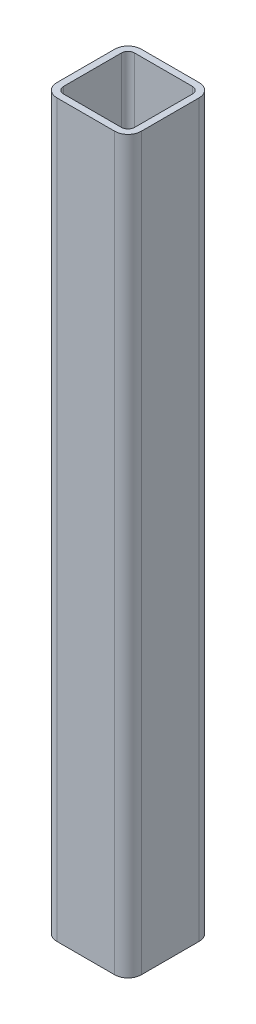
ISO-10303-21;
HEADER;
FILE_DESCRIPTION(('STEP AP214'),'2;1');
FILE_NAME('part.step','',(''),(''),'','','');
FILE_SCHEMA(('AUTOMOTIVE_DESIGN { 1 0 10303 214 1 1 1 1 }'));
ENDSEC;
DATA;
#1=APPLICATION_CONTEXT('core data for automotive mechanical design processes');
#2=APPLICATION_PROTOCOL_DEFINITION('international standard','automotive_design',2000,#1);
#3=PRODUCT_CONTEXT('',#1,'mechanical');
#4=PRODUCT('Part','Part','',(#3));
#5=PRODUCT_RELATED_PRODUCT_CATEGORY('part','',(#4));
#6=PRODUCT_DEFINITION_FORMATION('','',#4);
#7=PRODUCT_DEFINITION_CONTEXT('part definition',#1,'design');
#8=PRODUCT_DEFINITION('design','',#6,#7);
#9=PRODUCT_DEFINITION_SHAPE('','',#8);
#10=(LENGTH_UNIT() NAMED_UNIT(*) SI_UNIT(.MILLI.,.METRE.));
#11=(NAMED_UNIT(*) PLANE_ANGLE_UNIT() SI_UNIT($,.RADIAN.));
#12=(NAMED_UNIT(*) SI_UNIT($,.STERADIAN.) SOLID_ANGLE_UNIT());
#13=UNCERTAINTY_MEASURE_WITH_UNIT(LENGTH_MEASURE(1.E-05),#10,'distance_accuracy_value','');
#14=(GEOMETRIC_REPRESENTATION_CONTEXT(3) GLOBAL_UNCERTAINTY_ASSIGNED_CONTEXT((#13)) GLOBAL_UNIT_ASSIGNED_CONTEXT((#10,
#11,#12)) REPRESENTATION_CONTEXT('',''));
#15=CARTESIAN_POINT('',(0.,0.,0.));
#16=DIRECTION('',(0.,0.,1.));
#17=DIRECTION('',(1.,0.,0.));
#18=AXIS2_PLACEMENT_3D('',#15,#16,#17);
#19=CARTESIAN_POINT('',(8.7,220.,-8.7));
#20=DIRECTION('',(0.,-1.,0.));
#21=DIRECTION('',(0.,0.,-1.));
#22=AXIS2_PLACEMENT_3D('',#19,#20,#21);
#23=CYLINDRICAL_SURFACE('',#22,4.);
#24=CARTESIAN_POINT('',(8.7,0.,-8.7));
#25=DIRECTION('',(0.,1.,0.));
#26=DIRECTION('',(0.,0.,1.));
#27=AXIS2_PLACEMENT_3D('',#24,#25,#26);
#28=CIRCLE('',#27,4.);
#29=CARTESIAN_POINT('',(12.7,0.,-8.69999999999999));
#30=VERTEX_POINT('',#29);
#31=CARTESIAN_POINT('',(8.7,0.,-12.7));
#32=VERTEX_POINT('',#31);
#33=EDGE_CURVE('E239',#30,#32,#28,.T.);
#34=ORIENTED_EDGE('',*,*,#33,.T.);
#35=DIRECTION('',(0.,-1.,0.));
#36=VECTOR('',#35,1.);
#37=CARTESIAN_POINT('',(8.7,220.,-12.7));
#38=LINE('',#37,#36);
#39=CARTESIAN_POINT('',(8.7,220.,-12.7));
#40=VERTEX_POINT('',#39);
#41=EDGE_CURVE('E12',#40,#32,#38,.T.);
#42=ORIENTED_EDGE('',*,*,#41,.F.);
#43=CARTESIAN_POINT('',(8.7,220.,-8.7));
#44=DIRECTION('',(0.,1.,0.));
#45=DIRECTION('',(0.,0.,1.));
#46=AXIS2_PLACEMENT_3D('',#43,#44,#45);
#47=CIRCLE('',#46,4.);
#48=CARTESIAN_POINT('',(12.7,220.,-8.69999999999999));
#49=VERTEX_POINT('',#48);
#50=EDGE_CURVE('E317',#49,#40,#47,.T.);
#51=ORIENTED_EDGE('',*,*,#50,.F.);
#52=DIRECTION('',(0.,-1.,0.));
#53=VECTOR('',#52,1.);
#54=CARTESIAN_POINT('',(12.7,220.,-8.69999999999999));
#55=LINE('',#54,#53);
#56=EDGE_CURVE('E254',#49,#30,#55,.T.);
#57=ORIENTED_EDGE('',*,*,#56,.T.);
#58=EDGE_LOOP('',(#34,#42,#51,#57));
#59=FACE_BOUND('',#58,.T.);
#60=ADVANCED_FACE('F67',(#59),#23,.T.);
#61=CARTESIAN_POINT('',(8.7,220.,-12.7));
#62=DIRECTION('',(0.,0.,1.));
#63=DIRECTION('',(1.,0.,0.));
#64=AXIS2_PLACEMENT_3D('',#61,#62,#63);
#65=PLANE('',#64);
#66=DIRECTION('',(-1.,0.,0.));
#67=VECTOR('',#66,1.);
#68=CARTESIAN_POINT('',(8.7,0.,-12.7));
#69=LINE('',#68,#67);
#70=CARTESIAN_POINT('',(-8.7,0.,-12.7));
#71=VERTEX_POINT('',#70);
#72=EDGE_CURVE('E242',#32,#71,#69,.T.);
#73=ORIENTED_EDGE('',*,*,#72,.T.);
#74=DIRECTION('',(0.,-1.,0.));
#75=VECTOR('',#74,1.);
#76=CARTESIAN_POINT('',(-8.7,220.,-12.7));
#77=LINE('',#76,#75);
#78=CARTESIAN_POINT('',(-8.7,220.,-12.7));
#79=VERTEX_POINT('',#78);
#80=EDGE_CURVE('E77',#79,#71,#77,.T.);
#81=ORIENTED_EDGE('',*,*,#80,.F.);
#82=DIRECTION('',(-1.,0.,0.));
#83=VECTOR('',#82,1.);
#84=CARTESIAN_POINT('',(8.7,220.,-12.7));
#85=LINE('',#84,#83);
#86=EDGE_CURVE('E319',#40,#79,#85,.T.);
#87=ORIENTED_EDGE('',*,*,#86,.F.);
#88=ORIENTED_EDGE('',*,*,#41,.T.);
#89=EDGE_LOOP('',(#73,#81,#87,#88));
#90=FACE_BOUND('',#89,.T.);
#91=ADVANCED_FACE('F354',(#90),#65,.F.);
#92=CARTESIAN_POINT('',(-8.7,220.,-8.7));
#93=DIRECTION('',(0.,-1.,0.));
#94=DIRECTION('',(0.,0.,-1.));
#95=AXIS2_PLACEMENT_3D('',#92,#93,#94);
#96=CYLINDRICAL_SURFACE('',#95,4.);
#97=CARTESIAN_POINT('',(-8.7,0.,-8.7));
#98=DIRECTION('',(0.,1.,0.));
#99=DIRECTION('',(0.,0.,1.));
#100=AXIS2_PLACEMENT_3D('',#97,#98,#99);
#101=CIRCLE('',#100,4.);
#102=CARTESIAN_POINT('',(-12.7,0.,-8.69999999999999));
#103=VERTEX_POINT('',#102);
#104=EDGE_CURVE('E244',#71,#103,#101,.T.);
#105=ORIENTED_EDGE('',*,*,#104,.T.);
#106=DIRECTION('',(0.,-1.,0.));
#107=VECTOR('',#106,1.);
#108=CARTESIAN_POINT('',(-12.7,220.,-8.69999999999999));
#109=LINE('',#108,#107);
#110=CARTESIAN_POINT('',(-12.7,220.,-8.69999999999999));
#111=VERTEX_POINT('',#110);
#112=EDGE_CURVE('E261',#111,#103,#109,.T.);
#113=ORIENTED_EDGE('',*,*,#112,.F.);
#114=CARTESIAN_POINT('',(-8.7,220.,-8.7));
#115=DIRECTION('',(0.,1.,0.));
#116=DIRECTION('',(0.,0.,1.));
#117=AXIS2_PLACEMENT_3D('',#114,#115,#116);
#118=CIRCLE('',#117,4.);
#119=EDGE_CURVE('E321',#79,#111,#118,.T.);
#120=ORIENTED_EDGE('',*,*,#119,.F.);
#121=ORIENTED_EDGE('',*,*,#80,.T.);
#122=EDGE_LOOP('',(#105,#113,#120,#121));
#123=FACE_BOUND('',#122,.T.);
#124=ADVANCED_FACE('F359',(#123),#96,.T.);
#125=CARTESIAN_POINT('',(-12.7,220.,8.69999999999999));
#126=DIRECTION('',(1.,0.,0.));
#127=DIRECTION('',(0.,0.,-1.));
#128=AXIS2_PLACEMENT_3D('',#125,#126,#127);
#129=PLANE('',#128);
#130=DIRECTION('',(0.,0.,1.));
#131=VECTOR('',#130,1.);
#132=CARTESIAN_POINT('',(-12.7,0.,8.69999999999999));
#133=LINE('',#132,#131);
#134=CARTESIAN_POINT('',(-12.7,0.,8.69999999999999));
#135=VERTEX_POINT('',#134);
#136=EDGE_CURVE('E246',#103,#135,#133,.T.);
#137=ORIENTED_EDGE('',*,*,#136,.T.);
#138=DIRECTION('',(0.,-1.,0.));
#139=VECTOR('',#138,1.);
#140=CARTESIAN_POINT('',(-12.7,220.,8.69999999999999));
#141=LINE('',#140,#139);
#142=CARTESIAN_POINT('',(-12.7,220.,8.69999999999999));
#143=VERTEX_POINT('',#142);
#144=EDGE_CURVE('E258',#143,#135,#141,.T.);
#145=ORIENTED_EDGE('',*,*,#144,.F.);
#146=DIRECTION('',(0.,0.,1.));
#147=VECTOR('',#146,1.);
#148=CARTESIAN_POINT('',(-12.7,220.,8.69999999999999));
#149=LINE('',#148,#147);
#150=EDGE_CURVE('E323',#111,#143,#149,.T.);
#151=ORIENTED_EDGE('',*,*,#150,.F.);
#152=ORIENTED_EDGE('',*,*,#112,.T.);
#153=EDGE_LOOP('',(#137,#145,#151,#152));
#154=FACE_BOUND('',#153,.T.);
#155=ADVANCED_FACE('F329',(#154),#129,.F.);
#156=CARTESIAN_POINT('',(-8.7,220.,8.7));
#157=DIRECTION('',(0.,-1.,0.));
#158=DIRECTION('',(0.,0.,-1.));
#159=AXIS2_PLACEMENT_3D('',#156,#157,#158);
#160=CYLINDRICAL_SURFACE('',#159,4.);
#161=CARTESIAN_POINT('',(-8.7,0.,8.7));
#162=DIRECTION('',(0.,1.,0.));
#163=DIRECTION('',(0.,0.,1.));
#164=AXIS2_PLACEMENT_3D('',#161,#162,#163);
#165=CIRCLE('',#164,4.);
#166=CARTESIAN_POINT('',(-8.7,0.,12.7));
#167=VERTEX_POINT('',#166);
#168=EDGE_CURVE('E248',#135,#167,#165,.T.);
#169=ORIENTED_EDGE('',*,*,#168,.T.);
#170=DIRECTION('',(0.,-1.,0.));
#171=VECTOR('',#170,1.);
#172=CARTESIAN_POINT('',(-8.7,220.,12.7));
#173=LINE('',#172,#171);
#174=CARTESIAN_POINT('',(-8.7,220.,12.7));
#175=VERTEX_POINT('',#174);
#176=EDGE_CURVE('E206',#175,#167,#173,.T.);
#177=ORIENTED_EDGE('',*,*,#176,.F.);
#178=CARTESIAN_POINT('',(-8.7,220.,8.7));
#179=DIRECTION('',(0.,1.,0.));
#180=DIRECTION('',(0.,0.,1.));
#181=AXIS2_PLACEMENT_3D('',#178,#179,#180);
#182=CIRCLE('',#181,4.);
#183=EDGE_CURVE('E197',#143,#175,#182,.T.);
#184=ORIENTED_EDGE('',*,*,#183,.F.);
#185=ORIENTED_EDGE('',*,*,#144,.T.);
#186=EDGE_LOOP('',(#169,#177,#184,#185));
#187=FACE_BOUND('',#186,.T.);
#188=ADVANCED_FACE('F333',(#187),#160,.T.);
#189=CARTESIAN_POINT('',(-8.7,220.,12.7));
#190=DIRECTION('',(0.,0.,-1.));
#191=DIRECTION('',(-1.,0.,0.));
#192=AXIS2_PLACEMENT_3D('',#189,#190,#191);
#193=PLANE('',#192);
#194=DIRECTION('',(1.,0.,0.));
#195=VECTOR('',#194,1.);
#196=CARTESIAN_POINT('',(-8.7,0.,12.7));
#197=LINE('',#196,#195);
#198=CARTESIAN_POINT('',(8.7,0.,12.7));
#199=VERTEX_POINT('',#198);
#200=EDGE_CURVE('E205',#167,#199,#197,.T.);
#201=ORIENTED_EDGE('',*,*,#200,.T.);
#202=DIRECTION('',(0.,-1.,0.));
#203=VECTOR('',#202,1.);
#204=CARTESIAN_POINT('',(8.7,220.,12.7));
#205=LINE('',#204,#203);
#206=CARTESIAN_POINT('',(8.7,220.,12.7));
#207=VERTEX_POINT('',#206);
#208=EDGE_CURVE('E202',#207,#199,#205,.T.);
#209=ORIENTED_EDGE('',*,*,#208,.F.);
#210=DIRECTION('',(1.,0.,0.));
#211=VECTOR('',#210,1.);
#212=CARTESIAN_POINT('',(-8.7,220.,12.7));
#213=LINE('',#212,#211);
#214=EDGE_CURVE('E191',#175,#207,#213,.T.);
#215=ORIENTED_EDGE('',*,*,#214,.F.);
#216=ORIENTED_EDGE('',*,*,#176,.T.);
#217=EDGE_LOOP('',(#201,#209,#215,#216));
#218=FACE_BOUND('',#217,.T.);
#219=ADVANCED_FACE('F203',(#218),#193,.F.);
#220=CARTESIAN_POINT('',(8.7,220.,8.7));
#221=DIRECTION('',(0.,-1.,0.));
#222=DIRECTION('',(0.,0.,-1.));
#223=AXIS2_PLACEMENT_3D('',#220,#221,#222);
#224=CYLINDRICAL_SURFACE('',#223,4.);
#225=CARTESIAN_POINT('',(8.7,0.,8.7));
#226=DIRECTION('',(0.,1.,0.));
#227=DIRECTION('',(0.,0.,1.));
#228=AXIS2_PLACEMENT_3D('',#225,#226,#227);
#229=CIRCLE('',#228,4.);
#230=CARTESIAN_POINT('',(12.7,0.,8.69999999999999));
#231=VERTEX_POINT('',#230);
#232=EDGE_CURVE('E139',#199,#231,#229,.T.);
#233=ORIENTED_EDGE('',*,*,#232,.T.);
#234=DIRECTION('',(0.,-1.,0.));
#235=VECTOR('',#234,1.);
#236=CARTESIAN_POINT('',(12.7,220.,8.69999999999999));
#237=LINE('',#236,#235);
#238=CARTESIAN_POINT('',(12.7,220.,8.69999999999999));
#239=VERTEX_POINT('',#238);
#240=EDGE_CURVE('E207',#239,#231,#237,.T.);
#241=ORIENTED_EDGE('',*,*,#240,.F.);
#242=CARTESIAN_POINT('',(8.7,220.,8.7));
#243=DIRECTION('',(0.,1.,0.));
#244=DIRECTION('',(0.,0.,1.));
#245=AXIS2_PLACEMENT_3D('',#242,#243,#244);
#246=CIRCLE('',#245,4.);
#247=EDGE_CURVE('E195',#207,#239,#246,.T.);
#248=ORIENTED_EDGE('',*,*,#247,.F.);
#249=ORIENTED_EDGE('',*,*,#208,.T.);
#250=EDGE_LOOP('',(#233,#241,#248,#249));
#251=FACE_BOUND('',#250,.T.);
#252=ADVANCED_FACE('F209',(#251),#224,.T.);
#253=CARTESIAN_POINT('',(-8.7,220.,-8.7));
#254=DIRECTION('',(0.,-1.,0.));
#255=DIRECTION('',(0.,0.,-1.));
#256=AXIS2_PLACEMENT_3D('',#253,#254,#255);
#257=CYLINDRICAL_SURFACE('',#256,2.);
#258=CARTESIAN_POINT('',(-8.7,0.,-8.7));
#259=DIRECTION('',(0.,1.,0.));
#260=DIRECTION('',(0.,0.,1.));
#261=AXIS2_PLACEMENT_3D('',#258,#259,#260);
#262=CIRCLE('',#261,2.);
#263=CARTESIAN_POINT('',(-8.7,0.,-10.7));
#264=VERTEX_POINT('',#263);
#265=CARTESIAN_POINT('',(-10.7,0.,-8.7));
#266=VERTEX_POINT('',#265);
#267=EDGE_CURVE('E215',#264,#266,#262,.T.);
#268=ORIENTED_EDGE('',*,*,#267,.F.);
#269=DIRECTION('',(0.,-1.,0.));
#270=VECTOR('',#269,1.);
#271=CARTESIAN_POINT('',(-8.7,220.,-10.7));
#272=LINE('',#271,#270);
#273=CARTESIAN_POINT('',(-8.7,220.,-10.7));
#274=VERTEX_POINT('',#273);
#275=EDGE_CURVE('E71',#274,#264,#272,.T.);
#276=ORIENTED_EDGE('',*,*,#275,.F.);
#277=CARTESIAN_POINT('',(-8.7,220.,-8.7));
#278=DIRECTION('',(0.,1.,0.));
#279=DIRECTION('',(0.,0.,1.));
#280=AXIS2_PLACEMENT_3D('',#277,#278,#279);
#281=CIRCLE('',#280,2.);
#282=CARTESIAN_POINT('',(-10.7,220.,-8.7));
#283=VERTEX_POINT('',#282);
#284=EDGE_CURVE('E253',#274,#283,#281,.T.);
#285=ORIENTED_EDGE('',*,*,#284,.T.);
#286=DIRECTION('',(0.,-1.,0.));
#287=VECTOR('',#286,1.);
#288=CARTESIAN_POINT('',(-10.7,220.,-8.7));
#289=LINE('',#288,#287);
#290=EDGE_CURVE('E211',#283,#266,#289,.T.);
#291=ORIENTED_EDGE('',*,*,#290,.T.);
#292=EDGE_LOOP('',(#268,#276,#285,#291));
#293=FACE_BOUND('',#292,.T.);
#294=ADVANCED_FACE('F69',(#293),#257,.F.);
#295=CARTESIAN_POINT('',(8.7,220.,-10.7));
#296=DIRECTION('',(0.,0.,1.));
#297=DIRECTION('',(1.,0.,0.));
#298=AXIS2_PLACEMENT_3D('',#295,#296,#297);
#299=PLANE('',#298);
#300=DIRECTION('',(-1.,0.,0.));
#301=VECTOR('',#300,1.);
#302=CARTESIAN_POINT('',(8.7,0.,-10.7));
#303=LINE('',#302,#301);
#304=CARTESIAN_POINT('',(8.7,0.,-10.7));
#305=VERTEX_POINT('',#304);
#306=EDGE_CURVE('E218',#305,#264,#303,.T.);
#307=ORIENTED_EDGE('',*,*,#306,.F.);
#308=DIRECTION('',(0.,-1.,0.));
#309=VECTOR('',#308,1.);
#310=CARTESIAN_POINT('',(8.7,220.,-10.7));
#311=LINE('',#310,#309);
#312=CARTESIAN_POINT('',(8.7,220.,-10.7));
#313=VERTEX_POINT('',#312);
#314=EDGE_CURVE('E276',#313,#305,#311,.T.);
#315=ORIENTED_EDGE('',*,*,#314,.F.);
#316=DIRECTION('',(-1.,0.,0.));
#317=VECTOR('',#316,1.);
#318=CARTESIAN_POINT('',(8.7,220.,-10.7));
#319=LINE('',#318,#317);
#320=EDGE_CURVE('E285',#313,#274,#319,.T.);
#321=ORIENTED_EDGE('',*,*,#320,.T.);
#322=ORIENTED_EDGE('',*,*,#275,.T.);
#323=EDGE_LOOP('',(#307,#315,#321,#322));
#324=FACE_BOUND('',#323,.T.);
#325=ADVANCED_FACE('F283',(#324),#299,.T.);
#326=CARTESIAN_POINT('',(8.7,220.,-8.7));
#327=DIRECTION('',(0.,-1.,0.));
#328=DIRECTION('',(0.,0.,-1.));
#329=AXIS2_PLACEMENT_3D('',#326,#327,#328);
#330=CYLINDRICAL_SURFACE('',#329,2.);
#331=CARTESIAN_POINT('',(8.7,0.,-8.7));
#332=DIRECTION('',(0.,1.,0.));
#333=DIRECTION('',(0.,0.,1.));
#334=AXIS2_PLACEMENT_3D('',#331,#332,#333);
#335=CIRCLE('',#334,2.);
#336=CARTESIAN_POINT('',(10.7,0.,-8.7));
#337=VERTEX_POINT('',#336);
#338=EDGE_CURVE('E221',#337,#305,#335,.T.);
#339=ORIENTED_EDGE('',*,*,#338,.F.);
#340=DIRECTION('',(0.,-1.,0.));
#341=VECTOR('',#340,1.);
#342=CARTESIAN_POINT('',(10.7,220.,-8.7));
#343=LINE('',#342,#341);
#344=CARTESIAN_POINT('',(10.7,220.,-8.7));
#345=VERTEX_POINT('',#344);
#346=EDGE_CURVE('E275',#345,#337,#343,.T.);
#347=ORIENTED_EDGE('',*,*,#346,.F.);
#348=CARTESIAN_POINT('',(8.7,220.,-8.7));
#349=DIRECTION('',(0.,1.,0.));
#350=DIRECTION('',(0.,0.,1.));
#351=AXIS2_PLACEMENT_3D('',#348,#349,#350);
#352=CIRCLE('',#351,2.);
#353=EDGE_CURVE('E293',#345,#313,#352,.T.);
#354=ORIENTED_EDGE('',*,*,#353,.T.);
#355=ORIENTED_EDGE('',*,*,#314,.T.);
#356=EDGE_LOOP('',(#339,#347,#354,#355));
#357=FACE_BOUND('',#356,.T.);
#358=ADVANCED_FACE('F291',(#357),#330,.F.);
#359=CARTESIAN_POINT('',(10.7,220.,-8.7));
#360=DIRECTION('',(-1.,0.,0.));
#361=DIRECTION('',(0.,0.,1.));
#362=AXIS2_PLACEMENT_3D('',#359,#360,#361);
#363=PLANE('',#362);
#364=DIRECTION('',(0.,0.,-1.));
#365=VECTOR('',#364,1.);
#366=CARTESIAN_POINT('',(10.7,0.,-8.7));
#367=LINE('',#366,#365);
#368=CARTESIAN_POINT('',(10.7,0.,8.7));
#369=VERTEX_POINT('',#368);
#370=EDGE_CURVE('E224',#369,#337,#367,.T.);
#371=ORIENTED_EDGE('',*,*,#370,.F.);
#372=DIRECTION('',(0.,-1.,0.));
#373=VECTOR('',#372,1.);
#374=CARTESIAN_POINT('',(10.7,220.,8.7));
#375=LINE('',#374,#373);
#376=CARTESIAN_POINT('',(10.7,220.,8.7));
#377=VERTEX_POINT('',#376);
#378=EDGE_CURVE('E273',#377,#369,#375,.T.);
#379=ORIENTED_EDGE('',*,*,#378,.F.);
#380=DIRECTION('',(0.,0.,-1.));
#381=VECTOR('',#380,1.);
#382=CARTESIAN_POINT('',(10.7,220.,-8.7));
#383=LINE('',#382,#381);
#384=EDGE_CURVE('E299',#377,#345,#383,.T.);
#385=ORIENTED_EDGE('',*,*,#384,.T.);
#386=ORIENTED_EDGE('',*,*,#346,.T.);
#387=EDGE_LOOP('',(#371,#379,#385,#386));
#388=FACE_BOUND('',#387,.T.);
#389=ADVANCED_FACE('F302',(#388),#363,.T.);
#390=CARTESIAN_POINT('',(8.7,220.,8.7));
#391=DIRECTION('',(0.,-1.,0.));
#392=DIRECTION('',(0.,0.,-1.));
#393=AXIS2_PLACEMENT_3D('',#390,#391,#392);
#394=CYLINDRICAL_SURFACE('',#393,2.);
#395=CARTESIAN_POINT('',(8.7,0.,8.7));
#396=DIRECTION('',(0.,1.,0.));
#397=DIRECTION('',(0.,0.,1.));
#398=AXIS2_PLACEMENT_3D('',#395,#396,#397);
#399=CIRCLE('',#398,2.);
#400=CARTESIAN_POINT('',(8.7,0.,10.7));
#401=VERTEX_POINT('',#400);
#402=EDGE_CURVE('E227',#401,#369,#399,.T.);
#403=ORIENTED_EDGE('',*,*,#402,.F.);
#404=DIRECTION('',(0.,-1.,0.));
#405=VECTOR('',#404,1.);
#406=CARTESIAN_POINT('',(8.7,220.,10.7));
#407=LINE('',#406,#405);
#408=CARTESIAN_POINT('',(8.7,220.,10.7));
#409=VERTEX_POINT('',#408);
#410=EDGE_CURVE('E271',#409,#401,#407,.T.);
#411=ORIENTED_EDGE('',*,*,#410,.F.);
#412=CARTESIAN_POINT('',(8.7,220.,8.7));
#413=DIRECTION('',(0.,1.,0.));
#414=DIRECTION('',(0.,0.,1.));
#415=AXIS2_PLACEMENT_3D('',#412,#413,#414);
#416=CIRCLE('',#415,2.);
#417=EDGE_CURVE('E303',#409,#377,#416,.T.);
#418=ORIENTED_EDGE('',*,*,#417,.T.);
#419=ORIENTED_EDGE('',*,*,#378,.T.);
#420=EDGE_LOOP('',(#403,#411,#418,#419));
#421=FACE_BOUND('',#420,.T.);
#422=ADVANCED_FACE('F370',(#421),#394,.F.);
#423=CARTESIAN_POINT('',(-8.7,220.,10.7));
#424=DIRECTION('',(0.,0.,-1.));
#425=DIRECTION('',(-1.,0.,0.));
#426=AXIS2_PLACEMENT_3D('',#423,#424,#425);
#427=PLANE('',#426);
#428=DIRECTION('',(1.,0.,0.));
#429=VECTOR('',#428,1.);
#430=CARTESIAN_POINT('',(-8.7,0.,10.7));
#431=LINE('',#430,#429);
#432=CARTESIAN_POINT('',(-8.7,0.,10.7));
#433=VERTEX_POINT('',#432);
#434=EDGE_CURVE('E230',#433,#401,#431,.T.);
#435=ORIENTED_EDGE('',*,*,#434,.F.);
#436=DIRECTION('',(0.,-1.,0.));
#437=VECTOR('',#436,1.);
#438=CARTESIAN_POINT('',(-8.7,220.,10.7));
#439=LINE('',#438,#437);
#440=CARTESIAN_POINT('',(-8.7,220.,10.7));
#441=VERTEX_POINT('',#440);
#442=EDGE_CURVE('E269',#441,#433,#439,.T.);
#443=ORIENTED_EDGE('',*,*,#442,.F.);
#444=DIRECTION('',(1.,0.,0.));
#445=VECTOR('',#444,1.);
#446=CARTESIAN_POINT('',(-8.7,220.,10.7));
#447=LINE('',#446,#445);
#448=EDGE_CURVE('E305',#441,#409,#447,.T.);
#449=ORIENTED_EDGE('',*,*,#448,.T.);
#450=ORIENTED_EDGE('',*,*,#410,.T.);
#451=EDGE_LOOP('',(#435,#443,#449,#450));
#452=FACE_BOUND('',#451,.T.);
#453=ADVANCED_FACE('F366',(#452),#427,.T.);
#454=CARTESIAN_POINT('',(-8.7,220.,8.7));
#455=DIRECTION('',(0.,-1.,0.));
#456=DIRECTION('',(0.,0.,-1.));
#457=AXIS2_PLACEMENT_3D('',#454,#455,#456);
#458=CYLINDRICAL_SURFACE('',#457,2.);
#459=CARTESIAN_POINT('',(-8.7,0.,8.7));
#460=DIRECTION('',(0.,1.,0.));
#461=DIRECTION('',(0.,0.,1.));
#462=AXIS2_PLACEMENT_3D('',#459,#460,#461);
#463=CIRCLE('',#462,2.);
#464=CARTESIAN_POINT('',(-10.7,0.,8.7));
#465=VERTEX_POINT('',#464);
#466=EDGE_CURVE('E233',#465,#433,#463,.T.);
#467=ORIENTED_EDGE('',*,*,#466,.F.);
#468=DIRECTION('',(0.,-1.,0.));
#469=VECTOR('',#468,1.);
#470=CARTESIAN_POINT('',(-10.7,220.,8.7));
#471=LINE('',#470,#469);
#472=CARTESIAN_POINT('',(-10.7,220.,8.7));
#473=VERTEX_POINT('',#472);
#474=EDGE_CURVE('E267',#473,#465,#471,.T.);
#475=ORIENTED_EDGE('',*,*,#474,.F.);
#476=CARTESIAN_POINT('',(-8.7,220.,8.7));
#477=DIRECTION('',(0.,1.,0.));
#478=DIRECTION('',(0.,0.,1.));
#479=AXIS2_PLACEMENT_3D('',#476,#477,#478);
#480=CIRCLE('',#479,2.);
#481=EDGE_CURVE('E311',#473,#441,#480,.T.);
#482=ORIENTED_EDGE('',*,*,#481,.T.);
#483=ORIENTED_EDGE('',*,*,#442,.T.);
#484=EDGE_LOOP('',(#467,#475,#482,#483));
#485=FACE_BOUND('',#484,.T.);
#486=ADVANCED_FACE('F348',(#485),#458,.F.);
#487=CARTESIAN_POINT('',(-10.7,220.,8.7));
#488=DIRECTION('',(1.,0.,0.));
#489=DIRECTION('',(0.,0.,-1.));
#490=AXIS2_PLACEMENT_3D('',#487,#488,#489);
#491=PLANE('',#490);
#492=DIRECTION('',(0.,0.,1.));
#493=VECTOR('',#492,1.);
#494=CARTESIAN_POINT('',(-10.7,0.,8.7));
#495=LINE('',#494,#493);
#496=EDGE_CURVE('E236',#266,#465,#495,.T.);
#497=ORIENTED_EDGE('',*,*,#496,.F.);
#498=ORIENTED_EDGE('',*,*,#290,.F.);
#499=DIRECTION('',(0.,0.,1.));
#500=VECTOR('',#499,1.);
#501=CARTESIAN_POINT('',(-10.7,220.,8.7));
#502=LINE('',#501,#500);
#503=EDGE_CURVE('E314',#283,#473,#502,.T.);
#504=ORIENTED_EDGE('',*,*,#503,.T.);
#505=ORIENTED_EDGE('',*,*,#474,.T.);
#506=EDGE_LOOP('',(#497,#498,#504,#505));
#507=FACE_BOUND('',#506,.T.);
#508=ADVANCED_FACE('F341',(#507),#491,.T.);
#509=CARTESIAN_POINT('',(12.7,220.,-8.69999999999999));
#510=DIRECTION('',(-1.,0.,0.));
#511=DIRECTION('',(0.,0.,1.));
#512=AXIS2_PLACEMENT_3D('',#509,#510,#511);
#513=PLANE('',#512);
#514=DIRECTION('',(0.,0.,-1.));
#515=VECTOR('',#514,1.);
#516=CARTESIAN_POINT('',(12.7,0.,-8.69999999999999));
#517=LINE('',#516,#515);
#518=EDGE_CURVE('E145',#231,#30,#517,.T.);
#519=ORIENTED_EDGE('',*,*,#518,.T.);
#520=ORIENTED_EDGE('',*,*,#56,.F.);
#521=DIRECTION('',(0.,0.,-1.));
#522=VECTOR('',#521,1.);
#523=CARTESIAN_POINT('',(12.7,220.,-8.69999999999999));
#524=LINE('',#523,#522);
#525=EDGE_CURVE('E86',#239,#49,#524,.T.);
#526=ORIENTED_EDGE('',*,*,#525,.F.);
#527=ORIENTED_EDGE('',*,*,#240,.T.);
#528=EDGE_LOOP('',(#519,#520,#526,#527));
#529=FACE_BOUND('',#528,.T.);
#530=ADVANCED_FACE('F339',(#529),#513,.F.);
#531=CARTESIAN_POINT('',(8.7,220.,-8.7));
#532=DIRECTION('',(0.,1.,0.));
#533=DIRECTION('',(0.,0.,1.));
#534=AXIS2_PLACEMENT_3D('',#531,#532,#533);
#535=PLANE('',#534);
#536=ORIENTED_EDGE('',*,*,#284,.F.);
#537=ORIENTED_EDGE('',*,*,#320,.F.);
#538=ORIENTED_EDGE('',*,*,#353,.F.);
#539=ORIENTED_EDGE('',*,*,#384,.F.);
#540=ORIENTED_EDGE('',*,*,#417,.F.);
#541=ORIENTED_EDGE('',*,*,#448,.F.);
#542=ORIENTED_EDGE('',*,*,#481,.F.);
#543=ORIENTED_EDGE('',*,*,#503,.F.);
#544=EDGE_LOOP('',(#536,#537,#538,#539,#540,#541,#542,#543));
#545=FACE_BOUND('',#544,.T.);
#546=ORIENTED_EDGE('',*,*,#50,.T.);
#547=ORIENTED_EDGE('',*,*,#86,.T.);
#548=ORIENTED_EDGE('',*,*,#119,.T.);
#549=ORIENTED_EDGE('',*,*,#150,.T.);
#550=ORIENTED_EDGE('',*,*,#183,.T.);
#551=ORIENTED_EDGE('',*,*,#214,.T.);
#552=ORIENTED_EDGE('',*,*,#247,.T.);
#553=ORIENTED_EDGE('',*,*,#525,.T.);
#554=EDGE_LOOP('',(#546,#547,#548,#549,#550,#551,#552,#553));
#555=FACE_BOUND('',#554,.T.);
#556=ADVANCED_FACE('F193',(#545,#555),#535,.T.);
#557=CARTESIAN_POINT('',(8.7,0.,-8.7));
#558=DIRECTION('',(0.,1.,0.));
#559=DIRECTION('',(0.,0.,1.));
#560=AXIS2_PLACEMENT_3D('',#557,#558,#559);
#561=PLANE('',#560);
#562=ORIENTED_EDGE('',*,*,#267,.T.);
#563=ORIENTED_EDGE('',*,*,#496,.T.);
#564=ORIENTED_EDGE('',*,*,#466,.T.);
#565=ORIENTED_EDGE('',*,*,#434,.T.);
#566=ORIENTED_EDGE('',*,*,#402,.T.);
#567=ORIENTED_EDGE('',*,*,#370,.T.);
#568=ORIENTED_EDGE('',*,*,#338,.T.);
#569=ORIENTED_EDGE('',*,*,#306,.T.);
#570=EDGE_LOOP('',(#562,#563,#564,#565,#566,#567,#568,#569));
#571=FACE_BOUND('',#570,.T.);
#572=ORIENTED_EDGE('',*,*,#33,.F.);
#573=ORIENTED_EDGE('',*,*,#518,.F.);
#574=ORIENTED_EDGE('',*,*,#232,.F.);
#575=ORIENTED_EDGE('',*,*,#200,.F.);
#576=ORIENTED_EDGE('',*,*,#168,.F.);
#577=ORIENTED_EDGE('',*,*,#136,.F.);
#578=ORIENTED_EDGE('',*,*,#104,.F.);
#579=ORIENTED_EDGE('',*,*,#72,.F.);
#580=EDGE_LOOP('',(#572,#573,#574,#575,#576,#577,#578,#579));
#581=FACE_BOUND('',#580,.T.);
#582=ADVANCED_FACE('F288',(#571,#581),#561,.F.);
#583=CLOSED_SHELL('',(#60,#91,#124,#155,#188,#219,#252,#294,#325,#358,#389,#422,#453,#486,#508,
#530,#556,#582));
#584=MANIFOLD_SOLID_BREP('B2',#583);
#585=ADVANCED_BREP_SHAPE_REPRESENTATION('',(#18,#584),#14);
#586=SHAPE_DEFINITION_REPRESENTATION(#9,#585);
ENDSEC;
END-ISO-10303-21;
